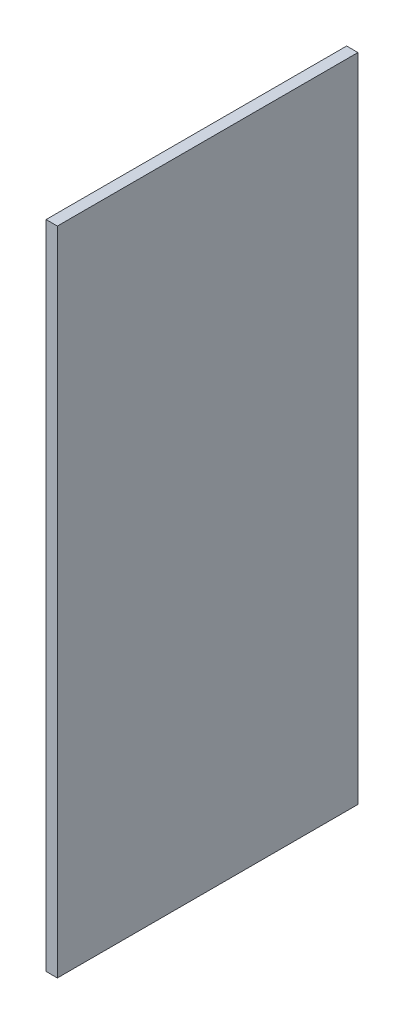
ISO-10303-21;
HEADER;
FILE_DESCRIPTION(('STEP AP214'),'2;1');
FILE_NAME('part.step','',(''),(''),'','','');
FILE_SCHEMA(('AUTOMOTIVE_DESIGN { 1 0 10303 214 1 1 1 1 }'));
ENDSEC;
DATA;
#1=APPLICATION_CONTEXT('core data for automotive mechanical design processes');
#2=APPLICATION_PROTOCOL_DEFINITION('international standard','automotive_design',2000,#1);
#3=PRODUCT_CONTEXT('',#1,'mechanical');
#4=PRODUCT('Part','Part','',(#3));
#5=PRODUCT_RELATED_PRODUCT_CATEGORY('part','',(#4));
#6=PRODUCT_DEFINITION_FORMATION('','',#4);
#7=PRODUCT_DEFINITION_CONTEXT('part definition',#1,'design');
#8=PRODUCT_DEFINITION('design','',#6,#7);
#9=PRODUCT_DEFINITION_SHAPE('','',#8);
#10=(LENGTH_UNIT() NAMED_UNIT(*) SI_UNIT(.MILLI.,.METRE.));
#11=(NAMED_UNIT(*) PLANE_ANGLE_UNIT() SI_UNIT($,.RADIAN.));
#12=(NAMED_UNIT(*) SI_UNIT($,.STERADIAN.) SOLID_ANGLE_UNIT());
#13=UNCERTAINTY_MEASURE_WITH_UNIT(LENGTH_MEASURE(1.E-05),#10,'distance_accuracy_value','');
#14=(GEOMETRIC_REPRESENTATION_CONTEXT(3) GLOBAL_UNCERTAINTY_ASSIGNED_CONTEXT((#13)) GLOBAL_UNIT_ASSIGNED_CONTEXT((#10,
#11,#12)) REPRESENTATION_CONTEXT('',''));
#15=CARTESIAN_POINT('',(0.,0.,0.));
#16=DIRECTION('',(0.,0.,1.));
#17=DIRECTION('',(1.,0.,0.));
#18=AXIS2_PLACEMENT_3D('',#15,#16,#17);
#19=CARTESIAN_POINT('',(1.5,120.,-818.5));
#20=DIRECTION('',(-1.,0.,0.));
#21=DIRECTION('',(0.,0.,1.));
#22=AXIS2_PLACEMENT_3D('',#19,#20,#21);
#23=PLANE('',#22);
#24=DIRECTION('',(0.,-1.,0.));
#25=VECTOR('',#24,1.);
#26=CARTESIAN_POINT('',(1.5,120.,-20.));
#27=LINE('',#26,#25);
#28=CARTESIAN_POINT('',(1.5,1850.,-20.));
#29=VERTEX_POINT('',#28);
#30=CARTESIAN_POINT('',(1.5,120.,-20.));
#31=VERTEX_POINT('',#30);
#32=EDGE_CURVE('E103',#29,#31,#27,.T.);
#33=ORIENTED_EDGE('',*,*,#32,.F.);
#34=DIRECTION('',(0.,0.,1.));
#35=VECTOR('',#34,1.);
#36=CARTESIAN_POINT('',(1.5,1850.,-818.5));
#37=LINE('',#36,#35);
#38=CARTESIAN_POINT('',(1.5,1850.,-818.5));
#39=VERTEX_POINT('',#38);
#40=EDGE_CURVE('E11',#39,#29,#37,.T.);
#41=ORIENTED_EDGE('',*,*,#40,.F.);
#42=DIRECTION('',(0.,-1.,0.));
#43=VECTOR('',#42,1.);
#44=CARTESIAN_POINT('',(1.5,120.,-818.5));
#45=LINE('',#44,#43);
#46=CARTESIAN_POINT('',(1.5,120.,-818.5));
#47=VERTEX_POINT('',#46);
#48=EDGE_CURVE('E97',#39,#47,#45,.T.);
#49=ORIENTED_EDGE('',*,*,#48,.T.);
#50=DIRECTION('',(0.,0.,1.));
#51=VECTOR('',#50,1.);
#52=CARTESIAN_POINT('',(1.5,120.,-818.5));
#53=LINE('',#52,#51);
#54=EDGE_CURVE('E42',#47,#31,#53,.T.);
#55=ORIENTED_EDGE('',*,*,#54,.T.);
#56=EDGE_LOOP('',(#33,#41,#49,#55));
#57=FACE_BOUND('',#56,.T.);
#58=ADVANCED_FACE('F39',(#57),#23,.T.);
#59=CARTESIAN_POINT('',(1.5,1850.,-818.5));
#60=DIRECTION('',(0.,1.,0.));
#61=DIRECTION('',(0.,0.,1.));
#62=AXIS2_PLACEMENT_3D('',#59,#60,#61);
#63=PLANE('',#62);
#64=DIRECTION('',(-1.,0.,0.));
#65=VECTOR('',#64,1.);
#66=CARTESIAN_POINT('',(1.5,1850.,-20.));
#67=LINE('',#66,#65);
#68=CARTESIAN_POINT('',(31.5,1850.,-20.));
#69=VERTEX_POINT('',#68);
#70=EDGE_CURVE('E99',#69,#29,#67,.T.);
#71=ORIENTED_EDGE('',*,*,#70,.F.);
#72=DIRECTION('',(0.,0.,1.));
#73=VECTOR('',#72,1.);
#74=CARTESIAN_POINT('',(31.5,1850.,-818.5));
#75=LINE('',#74,#73);
#76=CARTESIAN_POINT('',(31.5,1850.,-818.5));
#77=VERTEX_POINT('',#76);
#78=EDGE_CURVE('E48',#77,#69,#75,.T.);
#79=ORIENTED_EDGE('',*,*,#78,.F.);
#80=DIRECTION('',(-1.,0.,0.));
#81=VECTOR('',#80,1.);
#82=CARTESIAN_POINT('',(1.5,1850.,-818.5));
#83=LINE('',#82,#81);
#84=EDGE_CURVE('E94',#77,#39,#83,.T.);
#85=ORIENTED_EDGE('',*,*,#84,.T.);
#86=ORIENTED_EDGE('',*,*,#40,.T.);
#87=EDGE_LOOP('',(#71,#79,#85,#86));
#88=FACE_BOUND('',#87,.T.);
#89=ADVANCED_FACE('F113',(#88),#63,.T.);
#90=CARTESIAN_POINT('',(31.5,120.,-818.5));
#91=DIRECTION('',(1.,0.,0.));
#92=DIRECTION('',(0.,0.,-1.));
#93=AXIS2_PLACEMENT_3D('',#90,#91,#92);
#94=PLANE('',#93);
#95=DIRECTION('',(0.,1.,0.));
#96=VECTOR('',#95,1.);
#97=CARTESIAN_POINT('',(31.5,120.,-20.));
#98=LINE('',#97,#96);
#99=CARTESIAN_POINT('',(31.5,120.,-20.));
#100=VERTEX_POINT('',#99);
#101=EDGE_CURVE('E89',#100,#69,#98,.T.);
#102=ORIENTED_EDGE('',*,*,#101,.F.);
#103=DIRECTION('',(0.,0.,1.));
#104=VECTOR('',#103,1.);
#105=CARTESIAN_POINT('',(31.5,120.,-818.5));
#106=LINE('',#105,#104);
#107=CARTESIAN_POINT('',(31.5,120.,-818.5));
#108=VERTEX_POINT('',#107);
#109=EDGE_CURVE('E84',#108,#100,#106,.T.);
#110=ORIENTED_EDGE('',*,*,#109,.F.);
#111=DIRECTION('',(0.,1.,0.));
#112=VECTOR('',#111,1.);
#113=CARTESIAN_POINT('',(31.5,120.,-818.5));
#114=LINE('',#113,#112);
#115=EDGE_CURVE('E87',#108,#77,#114,.T.);
#116=ORIENTED_EDGE('',*,*,#115,.T.);
#117=ORIENTED_EDGE('',*,*,#78,.T.);
#118=EDGE_LOOP('',(#102,#110,#116,#117));
#119=FACE_BOUND('',#118,.T.);
#120=ADVANCED_FACE('F86',(#119),#94,.T.);
#121=CARTESIAN_POINT('',(1.5,120.,-818.5));
#122=DIRECTION('',(0.,-1.,0.));
#123=DIRECTION('',(0.,0.,-1.));
#124=AXIS2_PLACEMENT_3D('',#121,#122,#123);
#125=PLANE('',#124);
#126=DIRECTION('',(1.,0.,0.));
#127=VECTOR('',#126,1.);
#128=CARTESIAN_POINT('',(1.5,120.,-20.));
#129=LINE('',#128,#127);
#130=EDGE_CURVE('E106',#31,#100,#129,.T.);
#131=ORIENTED_EDGE('',*,*,#130,.F.);
#132=ORIENTED_EDGE('',*,*,#54,.F.);
#133=DIRECTION('',(1.,0.,0.));
#134=VECTOR('',#133,1.);
#135=CARTESIAN_POINT('',(1.5,120.,-818.5));
#136=LINE('',#135,#134);
#137=EDGE_CURVE('E93',#47,#108,#136,.T.);
#138=ORIENTED_EDGE('',*,*,#137,.T.);
#139=ORIENTED_EDGE('',*,*,#109,.T.);
#140=EDGE_LOOP('',(#131,#132,#138,#139));
#141=FACE_BOUND('',#140,.T.);
#142=ADVANCED_FACE('F96',(#141),#125,.T.);
#143=CARTESIAN_POINT('',(0.,0.,-818.5));
#144=DIRECTION('',(0.,0.,-1.));
#145=DIRECTION('',(-1.,0.,0.));
#146=AXIS2_PLACEMENT_3D('',#143,#144,#145);
#147=PLANE('',#146);
#148=ORIENTED_EDGE('',*,*,#48,.F.);
#149=ORIENTED_EDGE('',*,*,#84,.F.);
#150=ORIENTED_EDGE('',*,*,#115,.F.);
#151=ORIENTED_EDGE('',*,*,#137,.F.);
#152=EDGE_LOOP('',(#148,#149,#150,#151));
#153=FACE_BOUND('',#152,.T.);
#154=ADVANCED_FACE('F92',(#153),#147,.T.);
#155=CARTESIAN_POINT('',(0.,0.,-20.));
#156=DIRECTION('',(0.,0.,-1.));
#157=DIRECTION('',(-1.,0.,0.));
#158=AXIS2_PLACEMENT_3D('',#155,#156,#157);
#159=PLANE('',#158);
#160=ORIENTED_EDGE('',*,*,#32,.T.);
#161=ORIENTED_EDGE('',*,*,#130,.T.);
#162=ORIENTED_EDGE('',*,*,#101,.T.);
#163=ORIENTED_EDGE('',*,*,#70,.T.);
#164=EDGE_LOOP('',(#160,#161,#162,#163));
#165=FACE_BOUND('',#164,.T.);
#166=ADVANCED_FACE('F112',(#165),#159,.F.);
#167=CLOSED_SHELL('',(#58,#89,#120,#142,#154,#166));
#168=MANIFOLD_SOLID_BREP('B2',#167);
#169=ADVANCED_BREP_SHAPE_REPRESENTATION('',(#18,#168),#14);
#170=SHAPE_DEFINITION_REPRESENTATION(#9,#169);
ENDSEC;
END-ISO-10303-21;
